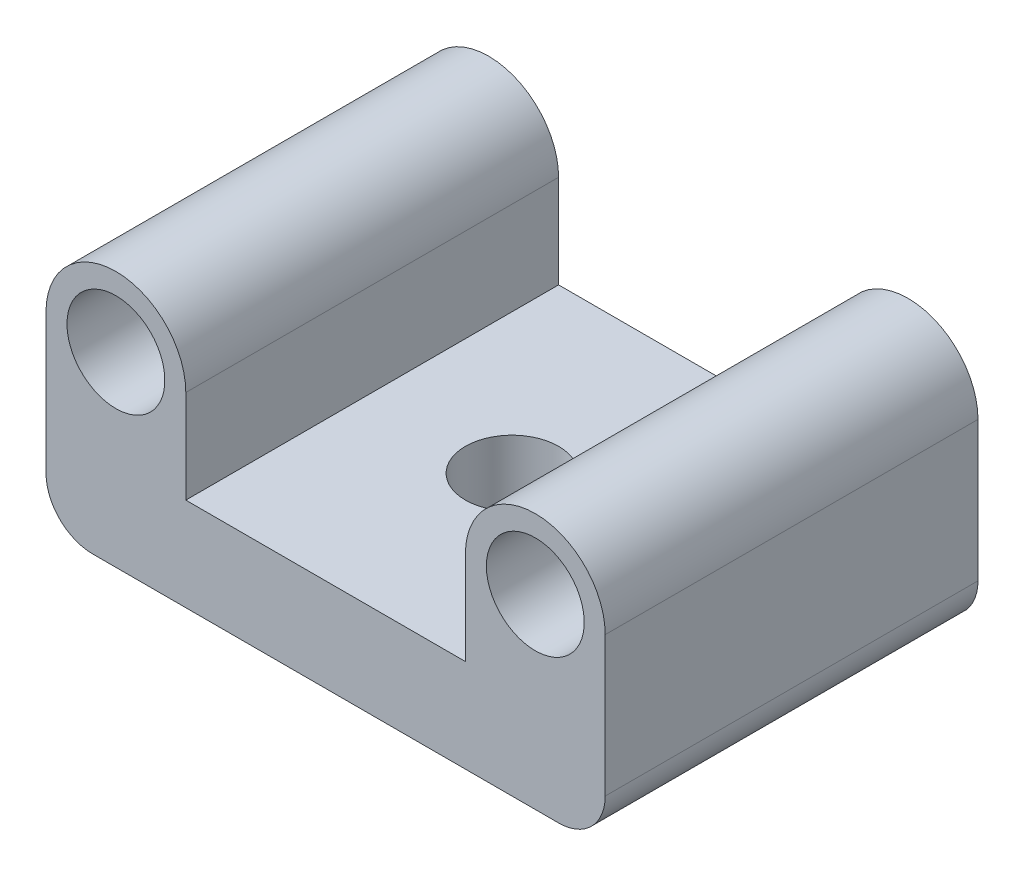
ISO-10303-21;
HEADER;
FILE_DESCRIPTION(('STEP AP214'),'2;1');
FILE_NAME('part.step','',(''),(''),'','','');
FILE_SCHEMA(('AUTOMOTIVE_DESIGN { 1 0 10303 214 1 1 1 1 }'));
ENDSEC;
DATA;
#1=APPLICATION_CONTEXT('core data for automotive mechanical design processes');
#2=APPLICATION_PROTOCOL_DEFINITION('international standard','automotive_design',2000,#1);
#3=PRODUCT_CONTEXT('',#1,'mechanical');
#4=PRODUCT('Part','Part','',(#3));
#5=PRODUCT_RELATED_PRODUCT_CATEGORY('part','',(#4));
#6=PRODUCT_DEFINITION_FORMATION('','',#4);
#7=PRODUCT_DEFINITION_CONTEXT('part definition',#1,'design');
#8=PRODUCT_DEFINITION('design','',#6,#7);
#9=PRODUCT_DEFINITION_SHAPE('','',#8);
#10=(LENGTH_UNIT() NAMED_UNIT(*) SI_UNIT(.MILLI.,.METRE.));
#11=(NAMED_UNIT(*) PLANE_ANGLE_UNIT() SI_UNIT($,.RADIAN.));
#12=(NAMED_UNIT(*) SI_UNIT($,.STERADIAN.) SOLID_ANGLE_UNIT());
#13=UNCERTAINTY_MEASURE_WITH_UNIT(LENGTH_MEASURE(1.E-05),#10,'distance_accuracy_value','');
#14=(GEOMETRIC_REPRESENTATION_CONTEXT(3) GLOBAL_UNCERTAINTY_ASSIGNED_CONTEXT((#13)) GLOBAL_UNIT_ASSIGNED_CONTEXT((#10,
#11,#12)) REPRESENTATION_CONTEXT('',''));
#15=CARTESIAN_POINT('',(0.,0.,0.));
#16=DIRECTION('',(0.,0.,1.));
#17=DIRECTION('',(1.,0.,0.));
#18=AXIS2_PLACEMENT_3D('',#15,#16,#17);
#19=CARTESIAN_POINT('',(0.,0.,0.));
#20=DIRECTION('',(0.,1.,0.));
#21=DIRECTION('',(0.,0.,1.));
#22=AXIS2_PLACEMENT_3D('',#19,#20,#21);
#23=PLANE('',#22);
#24=DIRECTION('',(1.,0.,0.));
#25=VECTOR('',#24,1.);
#26=CARTESIAN_POINT('',(0.,0.,4.));
#27=LINE('',#26,#25);
#28=CARTESIAN_POINT('',(1.,0.,4.));
#29=VERTEX_POINT('',#28);
#30=CARTESIAN_POINT('',(11.,0.,4.));
#31=VERTEX_POINT('',#30);
#32=EDGE_CURVE('E170',#29,#31,#27,.T.);
#33=ORIENTED_EDGE('',*,*,#32,.F.);
#34=DIRECTION('',(0.,0.,1.));
#35=VECTOR('',#34,1.);
#36=CARTESIAN_POINT('',(1.,0.,0.));
#37=LINE('',#36,#35);
#38=CARTESIAN_POINT('',(1.,0.,-4.));
#39=VERTEX_POINT('',#38);
#40=EDGE_CURVE('E57',#29,#39,#37,.F.);
#41=ORIENTED_EDGE('',*,*,#40,.T.);
#42=DIRECTION('',(-1.,0.,0.));
#43=VECTOR('',#42,1.);
#44=CARTESIAN_POINT('',(0.,0.,-4.));
#45=LINE('',#44,#43);
#46=CARTESIAN_POINT('',(11.,0.,-4.));
#47=VERTEX_POINT('',#46);
#48=EDGE_CURVE('E174',#47,#39,#45,.T.);
#49=ORIENTED_EDGE('',*,*,#48,.F.);
#50=DIRECTION('',(0.,0.,-1.));
#51=VECTOR('',#50,1.);
#52=CARTESIAN_POINT('',(11.,0.,0.));
#53=LINE('',#52,#51);
#54=EDGE_CURVE('E196',#47,#31,#53,.F.);
#55=ORIENTED_EDGE('',*,*,#54,.T.);
#56=EDGE_LOOP('',(#33,#41,#49,#55));
#57=FACE_BOUND('',#56,.T.);
#58=CARTESIAN_POINT('',(6.,0.,0.));
#59=DIRECTION('',(0.,1.,0.));
#60=DIRECTION('',(0.,0.,1.));
#61=AXIS2_PLACEMENT_3D('',#58,#59,#60);
#62=CIRCLE('',#61,1.5);
#63=CARTESIAN_POINT('',(6.,0.,1.5));
#64=VERTEX_POINT('',#63);
#65=EDGE_CURVE('E11',#64,#64,#62,.F.);
#66=ORIENTED_EDGE('',*,*,#65,.F.);
#67=EDGE_LOOP('',(#66));
#68=FACE_BOUND('',#67,.T.);
#69=ADVANCED_FACE('F34',(#57,#68),#23,.F.);
#70=CARTESIAN_POINT('',(0.,2.,0.));
#71=DIRECTION('',(0.,1.,0.));
#72=DIRECTION('',(0.,0.,1.));
#73=AXIS2_PLACEMENT_3D('',#70,#71,#72);
#74=PLANE('',#73);
#75=CARTESIAN_POINT('',(6.,2.,0.));
#76=DIRECTION('',(0.,1.,0.));
#77=DIRECTION('',(0.,0.,1.));
#78=AXIS2_PLACEMENT_3D('',#75,#76,#77);
#79=CIRCLE('',#78,1.);
#80=CARTESIAN_POINT('',(6.,2.,1.));
#81=VERTEX_POINT('',#80);
#82=EDGE_CURVE('E371',#81,#81,#79,.F.);
#83=ORIENTED_EDGE('',*,*,#82,.T.);
#84=EDGE_LOOP('',(#83));
#85=FACE_BOUND('',#84,.T.);
#86=DIRECTION('',(0.,0.,-1.));
#87=VECTOR('',#86,1.);
#88=CARTESIAN_POINT('',(3.00000000000001,2.,8.60977222864645));
#89=LINE('',#88,#87);
#90=CARTESIAN_POINT('',(3.,2.,4.));
#91=VERTEX_POINT('',#90);
#92=CARTESIAN_POINT('',(3.00000000000001,2.,-4.));
#93=VERTEX_POINT('',#92);
#94=EDGE_CURVE('E125',#91,#93,#89,.T.);
#95=ORIENTED_EDGE('',*,*,#94,.F.);
#96=DIRECTION('',(1.,0.,0.));
#97=VECTOR('',#96,1.);
#98=CARTESIAN_POINT('',(0.,2.,4.));
#99=LINE('',#98,#97);
#100=CARTESIAN_POINT('',(9.00000000000001,2.,4.));
#101=VERTEX_POINT('',#100);
#102=EDGE_CURVE('E171',#91,#101,#99,.T.);
#103=ORIENTED_EDGE('',*,*,#102,.T.);
#104=DIRECTION('',(0.,0.,-1.));
#105=VECTOR('',#104,1.);
#106=CARTESIAN_POINT('',(9.00000000000001,2.,8.60977222864645));
#107=LINE('',#106,#105);
#108=CARTESIAN_POINT('',(9.00000000000001,2.,-4.));
#109=VERTEX_POINT('',#108);
#110=EDGE_CURVE('E161',#101,#109,#107,.T.);
#111=ORIENTED_EDGE('',*,*,#110,.T.);
#112=DIRECTION('',(-1.,0.,0.));
#113=VECTOR('',#112,1.);
#114=CARTESIAN_POINT('',(0.,2.,-4.));
#115=LINE('',#114,#113);
#116=EDGE_CURVE('E173',#109,#93,#115,.T.);
#117=ORIENTED_EDGE('',*,*,#116,.T.);
#118=EDGE_LOOP('',(#95,#103,#111,#117));
#119=FACE_BOUND('',#118,.T.);
#120=ADVANCED_FACE('F223',(#85,#119),#74,.T.);
#121=CARTESIAN_POINT('',(0.,2.,-4.));
#122=DIRECTION('',(1.,0.,0.));
#123=DIRECTION('',(0.,0.,-1.));
#124=AXIS2_PLACEMENT_3D('',#121,#122,#123);
#125=PLANE('',#124);
#126=DIRECTION('',(0.,-1.,0.));
#127=VECTOR('',#126,1.);
#128=CARTESIAN_POINT('',(0.,2.,-4.));
#129=LINE('',#128,#127);
#130=CARTESIAN_POINT('',(0.,4.,-4.));
#131=VERTEX_POINT('',#130);
#132=CARTESIAN_POINT('',(0.,1.,-4.));
#133=VERTEX_POINT('',#132);
#134=EDGE_CURVE('E136',#131,#133,#129,.T.);
#135=ORIENTED_EDGE('',*,*,#134,.T.);
#136=DIRECTION('',(0.,0.,1.));
#137=VECTOR('',#136,1.);
#138=CARTESIAN_POINT('',(0.,1.,-4.));
#139=LINE('',#138,#137);
#140=CARTESIAN_POINT('',(0.,1.,4.));
#141=VERTEX_POINT('',#140);
#142=EDGE_CURVE('E189',#133,#141,#139,.T.);
#143=ORIENTED_EDGE('',*,*,#142,.T.);
#144=DIRECTION('',(0.,-1.,0.));
#145=VECTOR('',#144,1.);
#146=CARTESIAN_POINT('',(0.,2.,4.));
#147=LINE('',#146,#145);
#148=CARTESIAN_POINT('',(0.,4.,4.));
#149=VERTEX_POINT('',#148);
#150=EDGE_CURVE('E186',#149,#141,#147,.T.);
#151=ORIENTED_EDGE('',*,*,#150,.F.);
#152=DIRECTION('',(0.,0.,-1.));
#153=VECTOR('',#152,1.);
#154=CARTESIAN_POINT('',(0.,4.,8.60977222864645));
#155=LINE('',#154,#153);
#156=EDGE_CURVE('E146',#149,#131,#155,.T.);
#157=ORIENTED_EDGE('',*,*,#156,.T.);
#158=EDGE_LOOP('',(#135,#143,#151,#157));
#159=FACE_BOUND('',#158,.T.);
#160=ADVANCED_FACE('F221',(#159),#125,.F.);
#161=CARTESIAN_POINT('',(0.,2.,4.));
#162=DIRECTION('',(0.,0.,-1.));
#163=DIRECTION('',(-1.,0.,0.));
#164=AXIS2_PLACEMENT_3D('',#161,#162,#163);
#165=PLANE('',#164);
#166=CARTESIAN_POINT('',(10.5,4.,4.));
#167=DIRECTION('',(0.,0.,-1.));
#168=DIRECTION('',(-1.,0.,0.));
#169=AXIS2_PLACEMENT_3D('',#166,#167,#168);
#170=CIRCLE('',#169,1.05);
#171=CARTESIAN_POINT('',(9.45000000000002,4.,4.));
#172=VERTEX_POINT('',#171);
#173=EDGE_CURVE('E138',#172,#172,#170,.T.);
#174=ORIENTED_EDGE('',*,*,#173,.T.);
#175=EDGE_LOOP('',(#174));
#176=FACE_BOUND('',#175,.T.);
#177=CARTESIAN_POINT('',(1.50000000000001,4.,4.));
#178=DIRECTION('',(0.,0.,-1.));
#179=DIRECTION('',(-1.,0.,0.));
#180=AXIS2_PLACEMENT_3D('',#177,#178,#179);
#181=CIRCLE('',#180,1.05);
#182=CARTESIAN_POINT('',(0.450000000000004,4.,4.));
#183=VERTEX_POINT('',#182);
#184=EDGE_CURVE('E382',#183,#183,#181,.T.);
#185=ORIENTED_EDGE('',*,*,#184,.T.);
#186=EDGE_LOOP('',(#185));
#187=FACE_BOUND('',#186,.T.);
#188=ORIENTED_EDGE('',*,*,#150,.T.);
#189=CARTESIAN_POINT('',(1.,1.,4.));
#190=DIRECTION('',(0.,0.,-1.));
#191=DIRECTION('',(-1.,0.,0.));
#192=AXIS2_PLACEMENT_3D('',#189,#190,#191);
#193=CIRCLE('',#192,1.);
#194=EDGE_CURVE('E194',#141,#29,#193,.F.);
#195=ORIENTED_EDGE('',*,*,#194,.T.);
#196=ORIENTED_EDGE('',*,*,#32,.T.);
#197=CARTESIAN_POINT('',(11.,1.,4.));
#198=DIRECTION('',(0.,0.,-1.));
#199=DIRECTION('',(-1.,0.,0.));
#200=AXIS2_PLACEMENT_3D('',#197,#198,#199);
#201=CIRCLE('',#200,1.);
#202=CARTESIAN_POINT('',(12.,1.,4.));
#203=VERTEX_POINT('',#202);
#204=EDGE_CURVE('E192',#31,#203,#201,.F.);
#205=ORIENTED_EDGE('',*,*,#204,.T.);
#206=DIRECTION('',(0.,-1.,0.));
#207=VECTOR('',#206,1.);
#208=CARTESIAN_POINT('',(12.,2.,4.));
#209=LINE('',#208,#207);
#210=CARTESIAN_POINT('',(12.,4.,4.));
#211=VERTEX_POINT('',#210);
#212=EDGE_CURVE('E183',#211,#203,#209,.T.);
#213=ORIENTED_EDGE('',*,*,#212,.F.);
#214=CARTESIAN_POINT('',(10.5,4.,4.));
#215=DIRECTION('',(0.,0.,-1.));
#216=DIRECTION('',(-1.,0.,0.));
#217=AXIS2_PLACEMENT_3D('',#214,#215,#216);
#218=CIRCLE('',#217,1.49999999999999);
#219=CARTESIAN_POINT('',(9.00000000000002,4.,4.));
#220=VERTEX_POINT('',#219);
#221=EDGE_CURVE('E152',#211,#220,#218,.F.);
#222=ORIENTED_EDGE('',*,*,#221,.T.);
#223=DIRECTION('',(0.,-1.,0.));
#224=VECTOR('',#223,1.);
#225=CARTESIAN_POINT('',(9.00000000000001,4.,4.));
#226=LINE('',#225,#224);
#227=EDGE_CURVE('E154',#220,#101,#226,.T.);
#228=ORIENTED_EDGE('',*,*,#227,.T.);
#229=ORIENTED_EDGE('',*,*,#102,.F.);
#230=DIRECTION('',(0.,1.,0.));
#231=VECTOR('',#230,1.);
#232=CARTESIAN_POINT('',(3.00000000000001,4.,4.));
#233=LINE('',#232,#231);
#234=CARTESIAN_POINT('',(3.00000000000001,4.,4.));
#235=VERTEX_POINT('',#234);
#236=EDGE_CURVE('E149',#91,#235,#233,.T.);
#237=ORIENTED_EDGE('',*,*,#236,.T.);
#238=CARTESIAN_POINT('',(1.50000000000001,4.,4.));
#239=DIRECTION('',(0.,0.,-1.));
#240=DIRECTION('',(-1.,0.,0.));
#241=AXIS2_PLACEMENT_3D('',#238,#239,#240);
#242=CIRCLE('',#241,1.5);
#243=EDGE_CURVE('E122',#235,#149,#242,.F.);
#244=ORIENTED_EDGE('',*,*,#243,.T.);
#245=EDGE_LOOP('',(#188,#195,#196,#205,#213,#222,#228,#229,#237,#244));
#246=FACE_BOUND('',#245,.T.);
#247=ADVANCED_FACE('F212',(#176,#187,#246),#165,.F.);
#248=CARTESIAN_POINT('',(12.,2.,-4.));
#249=DIRECTION('',(-1.,0.,0.));
#250=DIRECTION('',(0.,0.,1.));
#251=AXIS2_PLACEMENT_3D('',#248,#249,#250);
#252=PLANE('',#251);
#253=ORIENTED_EDGE('',*,*,#212,.T.);
#254=DIRECTION('',(0.,0.,-1.));
#255=VECTOR('',#254,1.);
#256=CARTESIAN_POINT('',(12.,1.,-4.));
#257=LINE('',#256,#255);
#258=CARTESIAN_POINT('',(12.,1.,-4.));
#259=VERTEX_POINT('',#258);
#260=EDGE_CURVE('E42',#203,#259,#257,.T.);
#261=ORIENTED_EDGE('',*,*,#260,.T.);
#262=DIRECTION('',(0.,-1.,0.));
#263=VECTOR('',#262,1.);
#264=CARTESIAN_POINT('',(12.,2.,-4.));
#265=LINE('',#264,#263);
#266=CARTESIAN_POINT('',(12.,4.,-4.));
#267=VERTEX_POINT('',#266);
#268=EDGE_CURVE('E180',#267,#259,#265,.T.);
#269=ORIENTED_EDGE('',*,*,#268,.F.);
#270=DIRECTION('',(0.,0.,-1.));
#271=VECTOR('',#270,1.);
#272=CARTESIAN_POINT('',(12.,4.,8.60977222864645));
#273=LINE('',#272,#271);
#274=EDGE_CURVE('E155',#211,#267,#273,.T.);
#275=ORIENTED_EDGE('',*,*,#274,.F.);
#276=EDGE_LOOP('',(#253,#261,#269,#275));
#277=FACE_BOUND('',#276,.T.);
#278=ADVANCED_FACE('F202',(#277),#252,.F.);
#279=CARTESIAN_POINT('',(0.,2.,-4.));
#280=DIRECTION('',(0.,0.,1.));
#281=DIRECTION('',(1.,0.,0.));
#282=AXIS2_PLACEMENT_3D('',#279,#280,#281);
#283=PLANE('',#282);
#284=CARTESIAN_POINT('',(10.5,4.,-4.));
#285=DIRECTION('',(0.,0.,-1.));
#286=DIRECTION('',(-1.,0.,0.));
#287=AXIS2_PLACEMENT_3D('',#284,#285,#286);
#288=CIRCLE('',#287,1.05);
#289=CARTESIAN_POINT('',(9.45000000000002,4.,-4.));
#290=VERTEX_POINT('',#289);
#291=EDGE_CURVE('E141',#290,#290,#288,.T.);
#292=ORIENTED_EDGE('',*,*,#291,.F.);
#293=EDGE_LOOP('',(#292));
#294=FACE_BOUND('',#293,.T.);
#295=CARTESIAN_POINT('',(1.50000000000001,4.,-4.));
#296=DIRECTION('',(0.,0.,-1.));
#297=DIRECTION('',(-1.,0.,0.));
#298=AXIS2_PLACEMENT_3D('',#295,#296,#297);
#299=CIRCLE('',#298,1.05);
#300=CARTESIAN_POINT('',(0.450000000000004,4.,-4.));
#301=VERTEX_POINT('',#300);
#302=EDGE_CURVE('E375',#301,#301,#299,.T.);
#303=ORIENTED_EDGE('',*,*,#302,.F.);
#304=EDGE_LOOP('',(#303));
#305=FACE_BOUND('',#304,.T.);
#306=ORIENTED_EDGE('',*,*,#48,.T.);
#307=CARTESIAN_POINT('',(1.,1.,-4.));
#308=DIRECTION('',(0.,0.,1.));
#309=DIRECTION('',(1.,0.,0.));
#310=AXIS2_PLACEMENT_3D('',#307,#308,#309);
#311=CIRCLE('',#310,1.);
#312=EDGE_CURVE('E200',#39,#133,#311,.F.);
#313=ORIENTED_EDGE('',*,*,#312,.T.);
#314=ORIENTED_EDGE('',*,*,#134,.F.);
#315=CARTESIAN_POINT('',(1.50000000000001,4.,-4.));
#316=DIRECTION('',(0.,0.,-1.));
#317=DIRECTION('',(-1.,0.,0.));
#318=AXIS2_PLACEMENT_3D('',#315,#316,#317);
#319=CIRCLE('',#318,1.5);
#320=CARTESIAN_POINT('',(3.00000000000001,4.,-4.));
#321=VERTEX_POINT('',#320);
#322=EDGE_CURVE('E120',#131,#321,#319,.T.);
#323=ORIENTED_EDGE('',*,*,#322,.T.);
#324=DIRECTION('',(0.,-1.,0.));
#325=VECTOR('',#324,1.);
#326=CARTESIAN_POINT('',(3.00000000000001,4.,-4.));
#327=LINE('',#326,#325);
#328=EDGE_CURVE('E126',#321,#93,#327,.T.);
#329=ORIENTED_EDGE('',*,*,#328,.T.);
#330=ORIENTED_EDGE('',*,*,#116,.F.);
#331=DIRECTION('',(0.,1.,0.));
#332=VECTOR('',#331,1.);
#333=CARTESIAN_POINT('',(9.00000000000001,4.,-4.));
#334=LINE('',#333,#332);
#335=CARTESIAN_POINT('',(9.00000000000002,4.,-4.));
#336=VERTEX_POINT('',#335);
#337=EDGE_CURVE('E151',#109,#336,#334,.T.);
#338=ORIENTED_EDGE('',*,*,#337,.T.);
#339=CARTESIAN_POINT('',(10.5,4.,-4.));
#340=DIRECTION('',(0.,0.,-1.));
#341=DIRECTION('',(-1.,0.,0.));
#342=AXIS2_PLACEMENT_3D('',#339,#340,#341);
#343=CIRCLE('',#342,1.49999999999999);
#344=EDGE_CURVE('E158',#336,#267,#343,.T.);
#345=ORIENTED_EDGE('',*,*,#344,.T.);
#346=ORIENTED_EDGE('',*,*,#268,.T.);
#347=CARTESIAN_POINT('',(11.,1.,-4.));
#348=DIRECTION('',(0.,0.,1.));
#349=DIRECTION('',(1.,0.,0.));
#350=AXIS2_PLACEMENT_3D('',#347,#348,#349);
#351=CIRCLE('',#350,1.);
#352=EDGE_CURVE('E49',#259,#47,#351,.F.);
#353=ORIENTED_EDGE('',*,*,#352,.T.);
#354=EDGE_LOOP('',(#306,#313,#314,#323,#329,#330,#338,#345,#346,#353));
#355=FACE_BOUND('',#354,.T.);
#356=ADVANCED_FACE('F134',(#294,#305,#355),#283,.F.);
#357=CARTESIAN_POINT('',(10.5,4.,8.60977222864645));
#358=DIRECTION('',(0.,0.,-1.));
#359=DIRECTION('',(-1.,0.,0.));
#360=AXIS2_PLACEMENT_3D('',#357,#358,#359);
#361=CYLINDRICAL_SURFACE('',#360,1.49999999999999);
#362=ORIENTED_EDGE('',*,*,#221,.F.);
#363=ORIENTED_EDGE('',*,*,#274,.T.);
#364=ORIENTED_EDGE('',*,*,#344,.F.);
#365=DIRECTION('',(0.,0.,-1.));
#366=VECTOR('',#365,1.);
#367=CARTESIAN_POINT('',(9.00000000000002,4.,8.60977222864645));
#368=LINE('',#367,#366);
#369=EDGE_CURVE('E164',#220,#336,#368,.T.);
#370=ORIENTED_EDGE('',*,*,#369,.F.);
#371=EDGE_LOOP('',(#362,#363,#364,#370));
#372=FACE_BOUND('',#371,.T.);
#373=ADVANCED_FACE('F209',(#372),#361,.T.);
#374=CARTESIAN_POINT('',(9.00000000000001,4.,8.60977222864645));
#375=DIRECTION('',(-1.,0.,0.));
#376=DIRECTION('',(0.,-1.,0.));
#377=AXIS2_PLACEMENT_3D('',#374,#375,#376);
#378=PLANE('',#377);
#379=ORIENTED_EDGE('',*,*,#227,.F.);
#380=ORIENTED_EDGE('',*,*,#369,.T.);
#381=ORIENTED_EDGE('',*,*,#337,.F.);
#382=ORIENTED_EDGE('',*,*,#110,.F.);
#383=EDGE_LOOP('',(#379,#380,#381,#382));
#384=FACE_BOUND('',#383,.T.);
#385=ADVANCED_FACE('F225',(#384),#378,.T.);
#386=CARTESIAN_POINT('',(1.50000000000001,4.,8.60977222864645));
#387=DIRECTION('',(0.,0.,-1.));
#388=DIRECTION('',(-1.,0.,0.));
#389=AXIS2_PLACEMENT_3D('',#386,#387,#388);
#390=CYLINDRICAL_SURFACE('',#389,1.5);
#391=ORIENTED_EDGE('',*,*,#243,.F.);
#392=DIRECTION('',(0.,0.,-1.));
#393=VECTOR('',#392,1.);
#394=CARTESIAN_POINT('',(3.00000000000001,4.,8.60977222864645));
#395=LINE('',#394,#393);
#396=EDGE_CURVE('E115',#235,#321,#395,.T.);
#397=ORIENTED_EDGE('',*,*,#396,.T.);
#398=ORIENTED_EDGE('',*,*,#322,.F.);
#399=ORIENTED_EDGE('',*,*,#156,.F.);
#400=EDGE_LOOP('',(#391,#397,#398,#399));
#401=FACE_BOUND('',#400,.T.);
#402=ADVANCED_FACE('F117',(#401),#390,.T.);
#403=CARTESIAN_POINT('',(3.00000000000001,4.,8.60977222864645));
#404=DIRECTION('',(1.,0.,0.));
#405=DIRECTION('',(0.,1.,0.));
#406=AXIS2_PLACEMENT_3D('',#403,#404,#405);
#407=PLANE('',#406);
#408=ORIENTED_EDGE('',*,*,#236,.F.);
#409=ORIENTED_EDGE('',*,*,#94,.T.);
#410=ORIENTED_EDGE('',*,*,#328,.F.);
#411=ORIENTED_EDGE('',*,*,#396,.F.);
#412=EDGE_LOOP('',(#408,#409,#410,#411));
#413=FACE_BOUND('',#412,.T.);
#414=ADVANCED_FACE('F130',(#413),#407,.T.);
#415=CARTESIAN_POINT('',(1.50000000000001,4.,4.));
#416=DIRECTION('',(0.,0.,-1.));
#417=DIRECTION('',(-1.,0.,0.));
#418=AXIS2_PLACEMENT_3D('',#415,#416,#417);
#419=CYLINDRICAL_SURFACE('',#418,1.05);
#420=ORIENTED_EDGE('',*,*,#184,.F.);
#421=EDGE_LOOP('',(#420));
#422=FACE_BOUND('',#421,.T.);
#423=ORIENTED_EDGE('',*,*,#302,.T.);
#424=EDGE_LOOP('',(#423));
#425=FACE_BOUND('',#424,.T.);
#426=ADVANCED_FACE('F258',(#422,#425),#419,.F.);
#427=CARTESIAN_POINT('',(10.5,4.,4.));
#428=DIRECTION('',(0.,0.,-1.));
#429=DIRECTION('',(-1.,0.,0.));
#430=AXIS2_PLACEMENT_3D('',#427,#428,#429);
#431=CYLINDRICAL_SURFACE('',#430,1.05);
#432=ORIENTED_EDGE('',*,*,#173,.F.);
#433=EDGE_LOOP('',(#432));
#434=FACE_BOUND('',#433,.T.);
#435=ORIENTED_EDGE('',*,*,#291,.T.);
#436=EDGE_LOOP('',(#435));
#437=FACE_BOUND('',#436,.T.);
#438=ADVANCED_FACE('F252',(#434,#437),#431,.F.);
#439=CARTESIAN_POINT('',(1.,1.,-4.));
#440=DIRECTION('',(0.,0.,1.));
#441=DIRECTION('',(1.,0.,0.));
#442=AXIS2_PLACEMENT_3D('',#439,#440,#441);
#443=CYLINDRICAL_SURFACE('',#442,1.);
#444=ORIENTED_EDGE('',*,*,#312,.F.);
#445=ORIENTED_EDGE('',*,*,#40,.F.);
#446=ORIENTED_EDGE('',*,*,#194,.F.);
#447=ORIENTED_EDGE('',*,*,#142,.F.);
#448=EDGE_LOOP('',(#444,#445,#446,#447));
#449=FACE_BOUND('',#448,.T.);
#450=ADVANCED_FACE('F219',(#449),#443,.T.);
#451=CARTESIAN_POINT('',(11.,1.,-4.));
#452=DIRECTION('',(0.,0.,-1.));
#453=DIRECTION('',(-1.,0.,0.));
#454=AXIS2_PLACEMENT_3D('',#451,#452,#453);
#455=CYLINDRICAL_SURFACE('',#454,1.);
#456=ORIENTED_EDGE('',*,*,#204,.F.);
#457=ORIENTED_EDGE('',*,*,#54,.F.);
#458=ORIENTED_EDGE('',*,*,#352,.F.);
#459=ORIENTED_EDGE('',*,*,#260,.F.);
#460=EDGE_LOOP('',(#456,#457,#458,#459));
#461=FACE_BOUND('',#460,.T.);
#462=ADVANCED_FACE('F36',(#461),#455,.T.);
#463=CARTESIAN_POINT('',(6.,4.82842712474619,0.));
#464=DIRECTION('',(0.,-1.,0.));
#465=DIRECTION('',(0.,0.,-1.));
#466=AXIS2_PLACEMENT_3D('',#463,#464,#465);
#467=CYLINDRICAL_SURFACE('',#466,1.);
#468=ORIENTED_EDGE('',*,*,#82,.F.);
#469=EDGE_LOOP('',(#468));
#470=FACE_BOUND('',#469,.T.);
#471=CARTESIAN_POINT('',(6.,-1.,0.));
#472=DIRECTION('',(0.,-1.,0.));
#473=DIRECTION('',(0.,0.,-1.));
#474=AXIS2_PLACEMENT_3D('',#471,#472,#473);
#475=CIRCLE('',#474,1.);
#476=CARTESIAN_POINT('',(6.,-1.,-1.));
#477=VERTEX_POINT('',#476);
#478=EDGE_CURVE('E372',#477,#477,#475,.T.);
#479=ORIENTED_EDGE('',*,*,#478,.T.);
#480=EDGE_LOOP('',(#479));
#481=FACE_BOUND('',#480,.T.);
#482=ADVANCED_FACE('F257',(#470,#481),#467,.F.);
#483=CARTESIAN_POINT('',(6.,-1.,0.));
#484=DIRECTION('',(0.,-1.,0.));
#485=DIRECTION('',(0.,0.,-1.));
#486=AXIS2_PLACEMENT_3D('',#483,#484,#485);
#487=PLANE('',#486);
#488=CARTESIAN_POINT('',(6.,-1.,0.));
#489=DIRECTION('',(0.,-1.,0.));
#490=DIRECTION('',(0.,0.,-1.));
#491=AXIS2_PLACEMENT_3D('',#488,#489,#490);
#492=CIRCLE('',#491,1.5);
#493=CARTESIAN_POINT('',(6.,-1.,-1.5));
#494=VERTEX_POINT('',#493);
#495=EDGE_CURVE('E369',#494,#494,#492,.T.);
#496=ORIENTED_EDGE('',*,*,#495,.T.);
#497=EDGE_LOOP('',(#496));
#498=FACE_BOUND('',#497,.T.);
#499=ORIENTED_EDGE('',*,*,#478,.F.);
#500=EDGE_LOOP('',(#499));
#501=FACE_BOUND('',#500,.T.);
#502=ADVANCED_FACE('F344',(#498,#501),#487,.T.);
#503=CARTESIAN_POINT('',(6.,-1.,0.));
#504=DIRECTION('',(0.,1.,0.));
#505=DIRECTION('',(0.,0.,1.));
#506=AXIS2_PLACEMENT_3D('',#503,#504,#505);
#507=CYLINDRICAL_SURFACE('',#506,1.5);
#508=ORIENTED_EDGE('',*,*,#495,.F.);
#509=EDGE_LOOP('',(#508));
#510=FACE_BOUND('',#509,.T.);
#511=ORIENTED_EDGE('',*,*,#65,.T.);
#512=EDGE_LOOP('',(#511));
#513=FACE_BOUND('',#512,.T.);
#514=ADVANCED_FACE('F353',(#510,#513),#507,.T.);
#515=CLOSED_SHELL('',(#69,#120,#160,#247,#278,#356,#373,#385,#402,#414,#426,#438,#450,#462,#482,
#502,#514));
#516=MANIFOLD_SOLID_BREP('B2',#515);
#517=ADVANCED_BREP_SHAPE_REPRESENTATION('',(#18,#516),#14);
#518=SHAPE_DEFINITION_REPRESENTATION(#9,#517);
ENDSEC;
END-ISO-10303-21;
